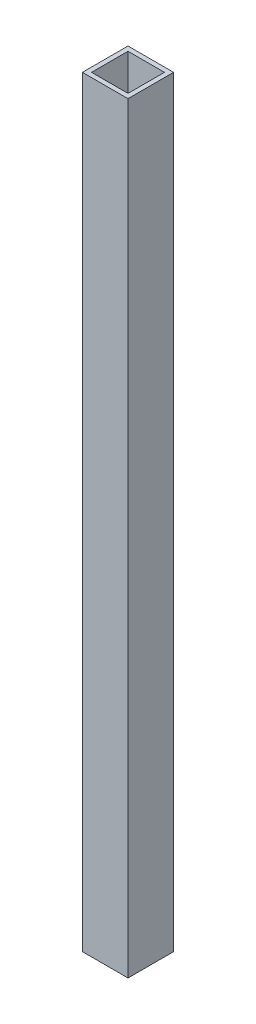
ISO-10303-21;
HEADER;
FILE_DESCRIPTION(('STEP AP214'),'2;1');
FILE_NAME('part.step','',(''),(''),'','','');
FILE_SCHEMA(('AUTOMOTIVE_DESIGN { 1 0 10303 214 1 1 1 1 }'));
ENDSEC;
DATA;
#1=APPLICATION_CONTEXT('core data for automotive mechanical design processes');
#2=APPLICATION_PROTOCOL_DEFINITION('international standard','automotive_design',2000,#1);
#3=PRODUCT_CONTEXT('',#1,'mechanical');
#4=PRODUCT('Part','Part','',(#3));
#5=PRODUCT_RELATED_PRODUCT_CATEGORY('part','',(#4));
#6=PRODUCT_DEFINITION_FORMATION('','',#4);
#7=PRODUCT_DEFINITION_CONTEXT('part definition',#1,'design');
#8=PRODUCT_DEFINITION('design','',#6,#7);
#9=PRODUCT_DEFINITION_SHAPE('','',#8);
#10=(LENGTH_UNIT() NAMED_UNIT(*) SI_UNIT(.MILLI.,.METRE.));
#11=(NAMED_UNIT(*) PLANE_ANGLE_UNIT() SI_UNIT($,.RADIAN.));
#12=(NAMED_UNIT(*) SI_UNIT($,.STERADIAN.) SOLID_ANGLE_UNIT());
#13=UNCERTAINTY_MEASURE_WITH_UNIT(LENGTH_MEASURE(1.E-05),#10,'distance_accuracy_value','');
#14=(GEOMETRIC_REPRESENTATION_CONTEXT(3) GLOBAL_UNCERTAINTY_ASSIGNED_CONTEXT((#13)) GLOBAL_UNIT_ASSIGNED_CONTEXT((#10,
#11,#12)) REPRESENTATION_CONTEXT('',''));
#15=CARTESIAN_POINT('',(0.,0.,0.));
#16=DIRECTION('',(0.,0.,1.));
#17=DIRECTION('',(1.,0.,0.));
#18=AXIS2_PLACEMENT_3D('',#15,#16,#17);
#19=CARTESIAN_POINT('',(0.,424.18,0.));
#20=DIRECTION('',(0.,-1.,0.));
#21=DIRECTION('',(0.,0.,-1.));
#22=AXIS2_PLACEMENT_3D('',#19,#20,#21);
#23=PLANE('',#22);
#24=DIRECTION('',(0.,0.,-1.));
#25=VECTOR('',#24,1.);
#26=CARTESIAN_POINT('',(12.7,424.18,12.7));
#27=LINE('',#26,#25);
#28=CARTESIAN_POINT('',(12.7,424.18,12.7));
#29=VERTEX_POINT('',#28);
#30=CARTESIAN_POINT('',(12.7,424.18,-12.7));
#31=VERTEX_POINT('',#30);
#32=EDGE_CURVE('E157',#29,#31,#27,.T.);
#33=ORIENTED_EDGE('',*,*,#32,.T.);
#34=DIRECTION('',(-1.,0.,0.));
#35=VECTOR('',#34,1.);
#36=CARTESIAN_POINT('',(-12.7,424.18,-12.7));
#37=LINE('',#36,#35);
#38=CARTESIAN_POINT('',(-12.7,424.18,-12.7));
#39=VERTEX_POINT('',#38);
#40=EDGE_CURVE('E161',#31,#39,#37,.T.);
#41=ORIENTED_EDGE('',*,*,#40,.T.);
#42=DIRECTION('',(0.,0.,1.));
#43=VECTOR('',#42,1.);
#44=CARTESIAN_POINT('',(-12.7,424.18,12.7));
#45=LINE('',#44,#43);
#46=CARTESIAN_POINT('',(-12.7,424.18,12.7));
#47=VERTEX_POINT('',#46);
#48=EDGE_CURVE('E165',#39,#47,#45,.T.);
#49=ORIENTED_EDGE('',*,*,#48,.T.);
#50=DIRECTION('',(1.,0.,0.));
#51=VECTOR('',#50,1.);
#52=CARTESIAN_POINT('',(-12.7,424.18,12.7));
#53=LINE('',#52,#51);
#54=EDGE_CURVE('E168',#47,#29,#53,.T.);
#55=ORIENTED_EDGE('',*,*,#54,.T.);
#56=EDGE_LOOP('',(#33,#41,#49,#55));
#57=FACE_BOUND('',#56,.T.);
#58=DIRECTION('',(0.,0.,1.));
#59=VECTOR('',#58,1.);
#60=CARTESIAN_POINT('',(-10.16,424.18,10.16));
#61=LINE('',#60,#59);
#62=CARTESIAN_POINT('',(-10.16,424.18,-10.16));
#63=VERTEX_POINT('',#62);
#64=CARTESIAN_POINT('',(-10.16,424.18,10.16));
#65=VERTEX_POINT('',#64);
#66=EDGE_CURVE('E109',#63,#65,#61,.T.);
#67=ORIENTED_EDGE('',*,*,#66,.F.);
#68=DIRECTION('',(-1.,0.,0.));
#69=VECTOR('',#68,1.);
#70=CARTESIAN_POINT('',(-10.16,424.18,-10.16));
#71=LINE('',#70,#69);
#72=CARTESIAN_POINT('',(10.16,424.18,-10.16));
#73=VERTEX_POINT('',#72);
#74=EDGE_CURVE('E135',#73,#63,#71,.T.);
#75=ORIENTED_EDGE('',*,*,#74,.F.);
#76=DIRECTION('',(0.,0.,-1.));
#77=VECTOR('',#76,1.);
#78=CARTESIAN_POINT('',(10.16,424.18,10.16));
#79=LINE('',#78,#77);
#80=CARTESIAN_POINT('',(10.16,424.18,10.16));
#81=VERTEX_POINT('',#80);
#82=EDGE_CURVE('E131',#81,#73,#79,.T.);
#83=ORIENTED_EDGE('',*,*,#82,.F.);
#84=DIRECTION('',(1.,0.,0.));
#85=VECTOR('',#84,1.);
#86=CARTESIAN_POINT('',(-10.16,424.18,10.16));
#87=LINE('',#86,#85);
#88=EDGE_CURVE('E118',#65,#81,#87,.T.);
#89=ORIENTED_EDGE('',*,*,#88,.F.);
#90=EDGE_LOOP('',(#67,#75,#83,#89));
#91=FACE_BOUND('',#90,.T.);
#92=ADVANCED_FACE('F43',(#57,#91),#23,.F.);
#93=CARTESIAN_POINT('',(0.,0.,0.));
#94=DIRECTION('',(0.,-1.,0.));
#95=DIRECTION('',(0.,0.,-1.));
#96=AXIS2_PLACEMENT_3D('',#93,#94,#95);
#97=PLANE('',#96);
#98=DIRECTION('',(0.,0.,-1.));
#99=VECTOR('',#98,1.);
#100=CARTESIAN_POINT('',(12.7,0.,12.7));
#101=LINE('',#100,#99);
#102=CARTESIAN_POINT('',(12.7,0.,12.7));
#103=VERTEX_POINT('',#102);
#104=CARTESIAN_POINT('',(12.7,0.,-12.7));
#105=VERTEX_POINT('',#104);
#106=EDGE_CURVE('E127',#103,#105,#101,.T.);
#107=ORIENTED_EDGE('',*,*,#106,.F.);
#108=DIRECTION('',(1.,0.,0.));
#109=VECTOR('',#108,1.);
#110=CARTESIAN_POINT('',(-12.7,0.,12.7));
#111=LINE('',#110,#109);
#112=CARTESIAN_POINT('',(-12.7,0.,12.7));
#113=VERTEX_POINT('',#112);
#114=EDGE_CURVE('E162',#113,#103,#111,.T.);
#115=ORIENTED_EDGE('',*,*,#114,.F.);
#116=DIRECTION('',(0.,0.,1.));
#117=VECTOR('',#116,1.);
#118=CARTESIAN_POINT('',(-12.7,0.,12.7));
#119=LINE('',#118,#117);
#120=CARTESIAN_POINT('',(-12.7,0.,-12.7));
#121=VERTEX_POINT('',#120);
#122=EDGE_CURVE('E178',#121,#113,#119,.T.);
#123=ORIENTED_EDGE('',*,*,#122,.F.);
#124=DIRECTION('',(-1.,0.,0.));
#125=VECTOR('',#124,1.);
#126=CARTESIAN_POINT('',(-12.7,0.,-12.7));
#127=LINE('',#126,#125);
#128=EDGE_CURVE('E175',#105,#121,#127,.T.);
#129=ORIENTED_EDGE('',*,*,#128,.F.);
#130=EDGE_LOOP('',(#107,#115,#123,#129));
#131=FACE_BOUND('',#130,.T.);
#132=DIRECTION('',(-1.,0.,0.));
#133=VECTOR('',#132,1.);
#134=CARTESIAN_POINT('',(-10.16,0.,-10.16));
#135=LINE('',#134,#133);
#136=CARTESIAN_POINT('',(10.16,0.,-10.16));
#137=VERTEX_POINT('',#136);
#138=CARTESIAN_POINT('',(-10.16,0.,-10.16));
#139=VERTEX_POINT('',#138);
#140=EDGE_CURVE('E119',#137,#139,#135,.T.);
#141=ORIENTED_EDGE('',*,*,#140,.T.);
#142=DIRECTION('',(0.,0.,1.));
#143=VECTOR('',#142,1.);
#144=CARTESIAN_POINT('',(-10.16,0.,10.16));
#145=LINE('',#144,#143);
#146=CARTESIAN_POINT('',(-10.16,0.,10.16));
#147=VERTEX_POINT('',#146);
#148=EDGE_CURVE('E67',#139,#147,#145,.T.);
#149=ORIENTED_EDGE('',*,*,#148,.T.);
#150=DIRECTION('',(1.,0.,0.));
#151=VECTOR('',#150,1.);
#152=CARTESIAN_POINT('',(-10.16,0.,10.16));
#153=LINE('',#152,#151);
#154=CARTESIAN_POINT('',(10.16,0.,10.16));
#155=VERTEX_POINT('',#154);
#156=EDGE_CURVE('E125',#147,#155,#153,.T.);
#157=ORIENTED_EDGE('',*,*,#156,.T.);
#158=DIRECTION('',(0.,0.,-1.));
#159=VECTOR('',#158,1.);
#160=CARTESIAN_POINT('',(10.16,0.,10.16));
#161=LINE('',#160,#159);
#162=EDGE_CURVE('E144',#155,#137,#161,.T.);
#163=ORIENTED_EDGE('',*,*,#162,.T.);
#164=EDGE_LOOP('',(#141,#149,#157,#163));
#165=FACE_BOUND('',#164,.T.);
#166=ADVANCED_FACE('F201',(#131,#165),#97,.T.);
#167=CARTESIAN_POINT('',(12.7,424.18,12.7));
#168=DIRECTION('',(-1.,0.,0.));
#169=DIRECTION('',(0.,0.,1.));
#170=AXIS2_PLACEMENT_3D('',#167,#168,#169);
#171=PLANE('',#170);
#172=ORIENTED_EDGE('',*,*,#106,.T.);
#173=DIRECTION('',(0.,-1.,0.));
#174=VECTOR('',#173,1.);
#175=CARTESIAN_POINT('',(12.7,424.18,-12.7));
#176=LINE('',#175,#174);
#177=EDGE_CURVE('E11',#31,#105,#176,.T.);
#178=ORIENTED_EDGE('',*,*,#177,.F.);
#179=ORIENTED_EDGE('',*,*,#32,.F.);
#180=DIRECTION('',(0.,-1.,0.));
#181=VECTOR('',#180,1.);
#182=CARTESIAN_POINT('',(12.7,424.18,12.7));
#183=LINE('',#182,#181);
#184=EDGE_CURVE('E171',#29,#103,#183,.T.);
#185=ORIENTED_EDGE('',*,*,#184,.T.);
#186=EDGE_LOOP('',(#172,#178,#179,#185));
#187=FACE_BOUND('',#186,.T.);
#188=ADVANCED_FACE('F45',(#187),#171,.F.);
#189=CARTESIAN_POINT('',(-12.7,424.18,-12.7));
#190=DIRECTION('',(0.,0.,1.));
#191=DIRECTION('',(1.,0.,0.));
#192=AXIS2_PLACEMENT_3D('',#189,#190,#191);
#193=PLANE('',#192);
#194=ORIENTED_EDGE('',*,*,#128,.T.);
#195=DIRECTION('',(0.,-1.,0.));
#196=VECTOR('',#195,1.);
#197=CARTESIAN_POINT('',(-12.7,424.18,-12.7));
#198=LINE('',#197,#196);
#199=EDGE_CURVE('E52',#39,#121,#198,.T.);
#200=ORIENTED_EDGE('',*,*,#199,.F.);
#201=ORIENTED_EDGE('',*,*,#40,.F.);
#202=ORIENTED_EDGE('',*,*,#177,.T.);
#203=EDGE_LOOP('',(#194,#200,#201,#202));
#204=FACE_BOUND('',#203,.T.);
#205=ADVANCED_FACE('F211',(#204),#193,.F.);
#206=CARTESIAN_POINT('',(-12.7,424.18,12.7));
#207=DIRECTION('',(1.,0.,0.));
#208=DIRECTION('',(0.,0.,-1.));
#209=AXIS2_PLACEMENT_3D('',#206,#207,#208);
#210=PLANE('',#209);
#211=ORIENTED_EDGE('',*,*,#122,.T.);
#212=DIRECTION('',(0.,-1.,0.));
#213=VECTOR('',#212,1.);
#214=CARTESIAN_POINT('',(-12.7,424.18,12.7));
#215=LINE('',#214,#213);
#216=EDGE_CURVE('E186',#47,#113,#215,.T.);
#217=ORIENTED_EDGE('',*,*,#216,.F.);
#218=ORIENTED_EDGE('',*,*,#48,.F.);
#219=ORIENTED_EDGE('',*,*,#199,.T.);
#220=EDGE_LOOP('',(#211,#217,#218,#219));
#221=FACE_BOUND('',#220,.T.);
#222=ADVANCED_FACE('F195',(#221),#210,.F.);
#223=CARTESIAN_POINT('',(-12.7,424.18,12.7));
#224=DIRECTION('',(0.,0.,-1.));
#225=DIRECTION('',(-1.,0.,0.));
#226=AXIS2_PLACEMENT_3D('',#223,#224,#225);
#227=PLANE('',#226);
#228=ORIENTED_EDGE('',*,*,#114,.T.);
#229=ORIENTED_EDGE('',*,*,#184,.F.);
#230=ORIENTED_EDGE('',*,*,#54,.F.);
#231=ORIENTED_EDGE('',*,*,#216,.T.);
#232=EDGE_LOOP('',(#228,#229,#230,#231));
#233=FACE_BOUND('',#232,.T.);
#234=ADVANCED_FACE('F205',(#233),#227,.F.);
#235=CARTESIAN_POINT('',(-10.16,424.18,10.16));
#236=DIRECTION('',(1.,0.,0.));
#237=DIRECTION('',(0.,0.,-1.));
#238=AXIS2_PLACEMENT_3D('',#235,#236,#237);
#239=PLANE('',#238);
#240=ORIENTED_EDGE('',*,*,#148,.F.);
#241=DIRECTION('',(0.,-1.,0.));
#242=VECTOR('',#241,1.);
#243=CARTESIAN_POINT('',(-10.16,424.18,-10.16));
#244=LINE('',#243,#242);
#245=EDGE_CURVE('E113',#63,#139,#244,.T.);
#246=ORIENTED_EDGE('',*,*,#245,.F.);
#247=ORIENTED_EDGE('',*,*,#66,.T.);
#248=DIRECTION('',(0.,-1.,0.));
#249=VECTOR('',#248,1.);
#250=CARTESIAN_POINT('',(-10.16,424.18,10.16));
#251=LINE('',#250,#249);
#252=EDGE_CURVE('E112',#65,#147,#251,.T.);
#253=ORIENTED_EDGE('',*,*,#252,.T.);
#254=EDGE_LOOP('',(#240,#246,#247,#253));
#255=FACE_BOUND('',#254,.T.);
#256=ADVANCED_FACE('F111',(#255),#239,.T.);
#257=CARTESIAN_POINT('',(-10.16,424.18,10.16));
#258=DIRECTION('',(0.,0.,-1.));
#259=DIRECTION('',(-1.,0.,0.));
#260=AXIS2_PLACEMENT_3D('',#257,#258,#259);
#261=PLANE('',#260);
#262=ORIENTED_EDGE('',*,*,#156,.F.);
#263=ORIENTED_EDGE('',*,*,#252,.F.);
#264=ORIENTED_EDGE('',*,*,#88,.T.);
#265=DIRECTION('',(0.,-1.,0.));
#266=VECTOR('',#265,1.);
#267=CARTESIAN_POINT('',(10.16,424.18,10.16));
#268=LINE('',#267,#266);
#269=EDGE_CURVE('E128',#81,#155,#268,.T.);
#270=ORIENTED_EDGE('',*,*,#269,.T.);
#271=EDGE_LOOP('',(#262,#263,#264,#270));
#272=FACE_BOUND('',#271,.T.);
#273=ADVANCED_FACE('F122',(#272),#261,.T.);
#274=CARTESIAN_POINT('',(10.16,424.18,10.16));
#275=DIRECTION('',(-1.,0.,0.));
#276=DIRECTION('',(0.,0.,1.));
#277=AXIS2_PLACEMENT_3D('',#274,#275,#276);
#278=PLANE('',#277);
#279=ORIENTED_EDGE('',*,*,#162,.F.);
#280=ORIENTED_EDGE('',*,*,#269,.F.);
#281=ORIENTED_EDGE('',*,*,#82,.T.);
#282=DIRECTION('',(0.,-1.,0.));
#283=VECTOR('',#282,1.);
#284=CARTESIAN_POINT('',(10.16,424.18,-10.16));
#285=LINE('',#284,#283);
#286=EDGE_CURVE('E59',#73,#137,#285,.T.);
#287=ORIENTED_EDGE('',*,*,#286,.T.);
#288=EDGE_LOOP('',(#279,#280,#281,#287));
#289=FACE_BOUND('',#288,.T.);
#290=ADVANCED_FACE('F234',(#289),#278,.T.);
#291=CARTESIAN_POINT('',(-10.16,424.18,-10.16));
#292=DIRECTION('',(0.,0.,1.));
#293=DIRECTION('',(1.,0.,0.));
#294=AXIS2_PLACEMENT_3D('',#291,#292,#293);
#295=PLANE('',#294);
#296=ORIENTED_EDGE('',*,*,#140,.F.);
#297=ORIENTED_EDGE('',*,*,#286,.F.);
#298=ORIENTED_EDGE('',*,*,#74,.T.);
#299=ORIENTED_EDGE('',*,*,#245,.T.);
#300=EDGE_LOOP('',(#296,#297,#298,#299));
#301=FACE_BOUND('',#300,.T.);
#302=ADVANCED_FACE('F238',(#301),#295,.T.);
#303=CLOSED_SHELL('',(#92,#166,#188,#205,#222,#234,#256,#273,#290,#302));
#304=MANIFOLD_SOLID_BREP('B2',#303);
#305=ADVANCED_BREP_SHAPE_REPRESENTATION('',(#18,#304),#14);
#306=SHAPE_DEFINITION_REPRESENTATION(#9,#305);
ENDSEC;
END-ISO-10303-21;
